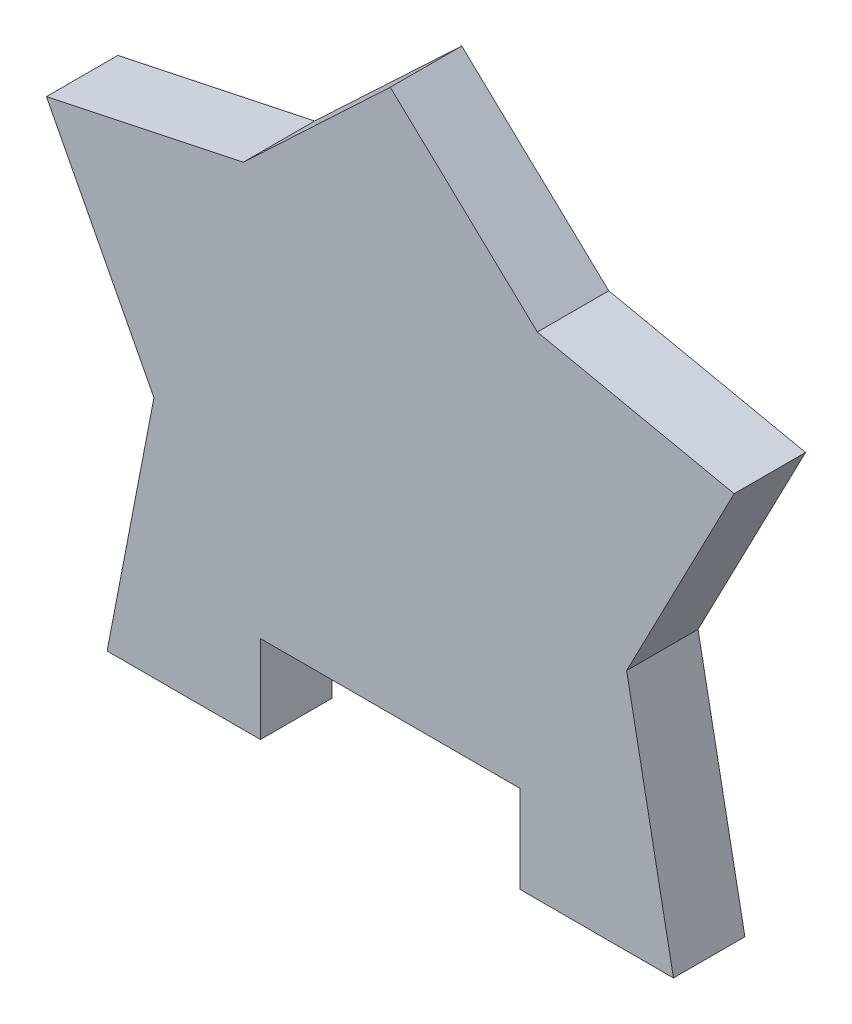
ISO-10303-21;
HEADER;
FILE_DESCRIPTION(('STEP AP214'),'2;1');
FILE_NAME('part.step','',(''),(''),'','','');
FILE_SCHEMA(('AUTOMOTIVE_DESIGN { 1 0 10303 214 1 1 1 1 }'));
ENDSEC;
DATA;
#1=APPLICATION_CONTEXT('core data for automotive mechanical design processes');
#2=APPLICATION_PROTOCOL_DEFINITION('international standard','automotive_design',2000,#1);
#3=PRODUCT_CONTEXT('',#1,'mechanical');
#4=PRODUCT('Part','Part','',(#3));
#5=PRODUCT_RELATED_PRODUCT_CATEGORY('part','',(#4));
#6=PRODUCT_DEFINITION_FORMATION('','',#4);
#7=PRODUCT_DEFINITION_CONTEXT('part definition',#1,'design');
#8=PRODUCT_DEFINITION('design','',#6,#7);
#9=PRODUCT_DEFINITION_SHAPE('','',#8);
#10=(LENGTH_UNIT() NAMED_UNIT(*) SI_UNIT(.MILLI.,.METRE.));
#11=(NAMED_UNIT(*) PLANE_ANGLE_UNIT() SI_UNIT($,.RADIAN.));
#12=(NAMED_UNIT(*) SI_UNIT($,.STERADIAN.) SOLID_ANGLE_UNIT());
#13=UNCERTAINTY_MEASURE_WITH_UNIT(LENGTH_MEASURE(1.E-05),#10,'distance_accuracy_value','');
#14=(GEOMETRIC_REPRESENTATION_CONTEXT(3) GLOBAL_UNCERTAINTY_ASSIGNED_CONTEXT((#13)) GLOBAL_UNIT_ASSIGNED_CONTEXT((#10,
#11,#12)) REPRESENTATION_CONTEXT('',''));
#15=CARTESIAN_POINT('',(0.,0.,0.));
#16=DIRECTION('',(0.,0.,1.));
#17=DIRECTION('',(1.,0.,0.));
#18=AXIS2_PLACEMENT_3D('',#15,#16,#17);
#19=CARTESIAN_POINT('',(0.,44.099252013809,10.));
#20=DIRECTION('',(-0.685525594121033,-0.728048528468402,0.));
#21=DIRECTION('',(0.728048528468402,-0.685525594121033,0.));
#22=AXIS2_PLACEMENT_3D('',#19,#20,#21);
#23=PLANE('',#22);
#24=DIRECTION('',(-0.728048528468402,0.685525594121033,0.));
#25=VECTOR('',#24,1.);
#26=CARTESIAN_POINT('',(0.,44.099252013809,0.));
#27=LINE('',#26,#25);
#28=CARTESIAN_POINT('',(20.593389074951,24.7086554690017,0.));
#29=VERTEX_POINT('',#28);
#30=CARTESIAN_POINT('',(0.,44.099252013809,0.));
#31=VERTEX_POINT('',#30);
#32=EDGE_CURVE('E170',#29,#31,#27,.T.);
#33=ORIENTED_EDGE('',*,*,#32,.T.);
#34=DIRECTION('',(0.,0.,-1.));
#35=VECTOR('',#34,1.);
#36=CARTESIAN_POINT('',(0.,44.099252013809,10.));
#37=LINE('',#36,#35);
#38=CARTESIAN_POINT('',(0.,44.099252013809,10.));
#39=VERTEX_POINT('',#38);
#40=EDGE_CURVE('E11',#39,#31,#37,.T.);
#41=ORIENTED_EDGE('',*,*,#40,.F.);
#42=DIRECTION('',(-0.728048528468402,0.685525594121033,0.));
#43=VECTOR('',#42,1.);
#44=CARTESIAN_POINT('',(0.,44.099252013809,10.));
#45=LINE('',#44,#43);
#46=CARTESIAN_POINT('',(20.593389074951,24.7086554690017,10.));
#47=VERTEX_POINT('',#46);
#48=EDGE_CURVE('E207',#47,#39,#45,.T.);
#49=ORIENTED_EDGE('',*,*,#48,.F.);
#50=DIRECTION('',(0.,0.,-1.));
#51=VECTOR('',#50,1.);
#52=CARTESIAN_POINT('',(20.593389074951,24.7086554690017,10.));
#53=LINE('',#52,#51);
#54=EDGE_CURVE('E166',#47,#29,#53,.T.);
#55=ORIENTED_EDGE('',*,*,#54,.T.);
#56=EDGE_LOOP('',(#33,#41,#49,#55));
#57=FACE_BOUND('',#56,.T.);
#58=ADVANCED_FACE('F39',(#57),#23,.F.);
#59=CARTESIAN_POINT('',(0.,44.099252013809,10.));
#60=DIRECTION('',(0.685525594121033,-0.728048528468401,0.));
#61=DIRECTION('',(0.728048528468401,0.685525594121033,0.));
#62=AXIS2_PLACEMENT_3D('',#59,#60,#61);
#63=PLANE('',#62);
#64=DIRECTION('',(-0.728048528468401,-0.685525594121033,0.));
#65=VECTOR('',#64,1.);
#66=CARTESIAN_POINT('',(0.,44.099252013809,0.));
#67=LINE('',#66,#65);
#68=CARTESIAN_POINT('',(-20.593389074951,24.7086554690017,0.));
#69=VERTEX_POINT('',#68);
#70=EDGE_CURVE('E174',#31,#69,#67,.T.);
#71=ORIENTED_EDGE('',*,*,#70,.T.);
#72=DIRECTION('',(0.,0.,-1.));
#73=VECTOR('',#72,1.);
#74=CARTESIAN_POINT('',(-20.593389074951,24.7086554690017,10.));
#75=LINE('',#74,#73);
#76=CARTESIAN_POINT('',(-20.593389074951,24.7086554690017,10.));
#77=VERTEX_POINT('',#76);
#78=EDGE_CURVE('E48',#77,#69,#75,.T.);
#79=ORIENTED_EDGE('',*,*,#78,.F.);
#80=DIRECTION('',(-0.728048528468401,-0.685525594121033,0.));
#81=VECTOR('',#80,1.);
#82=CARTESIAN_POINT('',(0.,44.099252013809,10.));
#83=LINE('',#82,#81);
#84=EDGE_CURVE('E114',#39,#77,#83,.T.);
#85=ORIENTED_EDGE('',*,*,#84,.F.);
#86=ORIENTED_EDGE('',*,*,#40,.T.);
#87=EDGE_LOOP('',(#71,#79,#85,#86));
#88=FACE_BOUND('',#87,.T.);
#89=ADVANCED_FACE('F308',(#88),#63,.F.);
#90=CARTESIAN_POINT('',(-20.593389074951,24.7086554690017,10.));
#91=DIRECTION('',(0.206772924601104,-0.978388960307661,0.));
#92=DIRECTION('',(0.978388960307661,0.206772924601104,0.));
#93=AXIS2_PLACEMENT_3D('',#90,#91,#92);
#94=PLANE('',#93);
#95=DIRECTION('',(-0.978388960307661,-0.206772924601104,0.));
#96=VECTOR('',#95,1.);
#97=CARTESIAN_POINT('',(-20.593389074951,24.7086554690017,0.));
#98=LINE('',#97,#96);
#99=CARTESIAN_POINT('',(-48.1527328956645,18.8842580635932,0.));
#100=VERTEX_POINT('',#99);
#101=EDGE_CURVE('E177',#69,#100,#98,.T.);
#102=ORIENTED_EDGE('',*,*,#101,.T.);
#103=DIRECTION('',(0.,0.,-1.));
#104=VECTOR('',#103,1.);
#105=CARTESIAN_POINT('',(-48.1527328956645,18.8842580635932,10.));
#106=LINE('',#105,#104);
#107=CARTESIAN_POINT('',(-48.1527328956645,18.8842580635932,10.));
#108=VERTEX_POINT('',#107);
#109=EDGE_CURVE('E238',#108,#100,#106,.T.);
#110=ORIENTED_EDGE('',*,*,#109,.F.);
#111=DIRECTION('',(-0.978388960307661,-0.206772924601104,0.));
#112=VECTOR('',#111,1.);
#113=CARTESIAN_POINT('',(-20.593389074951,24.7086554690017,10.));
#114=LINE('',#113,#112);
#115=EDGE_CURVE('E248',#77,#108,#114,.T.);
#116=ORIENTED_EDGE('',*,*,#115,.F.);
#117=ORIENTED_EDGE('',*,*,#78,.T.);
#118=EDGE_LOOP('',(#102,#110,#116,#117));
#119=FACE_BOUND('',#118,.T.);
#120=ADVANCED_FACE('F246',(#119),#94,.F.);
#121=CARTESIAN_POINT('',(-48.1527328956645,18.8842580635932,10.));
#122=DIRECTION('',(0.887359195725555,0.461078797778965,0.));
#123=DIRECTION('',(-0.461078797778965,0.887359195725555,0.));
#124=AXIS2_PLACEMENT_3D('',#121,#122,#123);
#125=PLANE('',#124);
#126=DIRECTION('',(0.461078797778965,-0.887359195725555,0.));
#127=VECTOR('',#126,1.);
#128=CARTESIAN_POINT('',(-48.1527328956645,18.8842580635932,0.));
#129=LINE('',#128,#127);
#130=CARTESIAN_POINT('',(-33.0945347255839,-10.0956704901467,0.));
#131=VERTEX_POINT('',#130);
#132=EDGE_CURVE('E180',#100,#131,#129,.T.);
#133=ORIENTED_EDGE('',*,*,#132,.T.);
#134=DIRECTION('',(0.,0.,-1.));
#135=VECTOR('',#134,1.);
#136=CARTESIAN_POINT('',(-33.0945347255839,-10.0956704901467,10.));
#137=LINE('',#136,#135);
#138=CARTESIAN_POINT('',(-33.0945347255839,-10.0956704901467,10.));
#139=VERTEX_POINT('',#138);
#140=EDGE_CURVE('E234',#139,#131,#137,.T.);
#141=ORIENTED_EDGE('',*,*,#140,.F.);
#142=DIRECTION('',(0.461078797778965,-0.887359195725555,0.));
#143=VECTOR('',#142,1.);
#144=CARTESIAN_POINT('',(-48.1527328956645,18.8842580635932,10.));
#145=LINE('',#144,#143);
#146=EDGE_CURVE('E267',#108,#139,#145,.T.);
#147=ORIENTED_EDGE('',*,*,#146,.F.);
#148=ORIENTED_EDGE('',*,*,#109,.T.);
#149=EDGE_LOOP('',(#133,#141,#147,#148));
#150=FACE_BOUND('',#149,.T.);
#151=ADVANCED_FACE('F257',(#150),#125,.F.);
#152=CARTESIAN_POINT('',(-33.0945347255839,-10.0956704901467,10.));
#153=DIRECTION('',(0.981892588561376,-0.189438498009882,0.));
#154=DIRECTION('',(0.189438498009882,0.981892588561376,0.));
#155=AXIS2_PLACEMENT_3D('',#152,#153,#154);
#156=PLANE('',#155);
#157=DIRECTION('',(-0.189438498009882,-0.981892588561376,0.));
#158=VECTOR('',#157,1.);
#159=CARTESIAN_POINT('',(-33.0945347255839,-10.0956704901467,0.));
#160=LINE('',#159,#158);
#161=CARTESIAN_POINT('',(-39.6549136161478,-44.099252013809,0.));
#162=VERTEX_POINT('',#161);
#163=EDGE_CURVE('E183',#131,#162,#160,.T.);
#164=ORIENTED_EDGE('',*,*,#163,.T.);
#165=DIRECTION('',(0.,0.,-1.));
#166=VECTOR('',#165,1.);
#167=CARTESIAN_POINT('',(-39.6549136161478,-44.099252013809,10.));
#168=LINE('',#167,#166);
#169=CARTESIAN_POINT('',(-39.6549136161478,-44.099252013809,10.));
#170=VERTEX_POINT('',#169);
#171=EDGE_CURVE('E230',#170,#162,#168,.T.);
#172=ORIENTED_EDGE('',*,*,#171,.F.);
#173=DIRECTION('',(-0.189438498009882,-0.981892588561376,0.));
#174=VECTOR('',#173,1.);
#175=CARTESIAN_POINT('',(-33.0945347255839,-10.0956704901467,10.));
#176=LINE('',#175,#174);
#177=EDGE_CURVE('E263',#139,#170,#176,.T.);
#178=ORIENTED_EDGE('',*,*,#177,.F.);
#179=ORIENTED_EDGE('',*,*,#140,.T.);
#180=EDGE_LOOP('',(#164,#172,#178,#179));
#181=FACE_BOUND('',#180,.T.);
#182=ADVANCED_FACE('F261',(#181),#156,.F.);
#183=CARTESIAN_POINT('',(-39.6549136161478,-44.099252013809,10.));
#184=DIRECTION('',(0.,1.,0.));
#185=DIRECTION('',(0.,0.,1.));
#186=AXIS2_PLACEMENT_3D('',#183,#184,#185);
#187=PLANE('',#186);
#188=DIRECTION('',(1.,0.,0.));
#189=VECTOR('',#188,1.);
#190=CARTESIAN_POINT('',(-39.6549136161478,-44.099252013809,0.));
#191=LINE('',#190,#189);
#192=CARTESIAN_POINT('',(-18.178395028806,-44.099252013809,0.));
#193=VERTEX_POINT('',#192);
#194=EDGE_CURVE('E186',#162,#193,#191,.T.);
#195=ORIENTED_EDGE('',*,*,#194,.T.);
#196=DIRECTION('',(0.,0.,-1.));
#197=VECTOR('',#196,1.);
#198=CARTESIAN_POINT('',(-18.178395028806,-44.099252013809,10.));
#199=LINE('',#198,#197);
#200=CARTESIAN_POINT('',(-18.178395028806,-44.099252013809,10.));
#201=VERTEX_POINT('',#200);
#202=EDGE_CURVE('E226',#201,#193,#199,.T.);
#203=ORIENTED_EDGE('',*,*,#202,.F.);
#204=DIRECTION('',(1.,0.,0.));
#205=VECTOR('',#204,1.);
#206=CARTESIAN_POINT('',(-39.6549136161478,-44.099252013809,10.));
#207=LINE('',#206,#205);
#208=EDGE_CURVE('E266',#170,#201,#207,.T.);
#209=ORIENTED_EDGE('',*,*,#208,.F.);
#210=ORIENTED_EDGE('',*,*,#171,.T.);
#211=EDGE_LOOP('',(#195,#203,#209,#210));
#212=FACE_BOUND('',#211,.T.);
#213=ADVANCED_FACE('F321',(#212),#187,.F.);
#214=CARTESIAN_POINT('',(-18.178395028806,-44.099252013809,10.));
#215=DIRECTION('',(-1.,0.,0.));
#216=DIRECTION('',(0.,0.,1.));
#217=AXIS2_PLACEMENT_3D('',#214,#215,#216);
#218=PLANE('',#217);
#219=DIRECTION('',(0.,1.,0.));
#220=VECTOR('',#219,1.);
#221=CARTESIAN_POINT('',(-18.178395028806,-44.099252013809,0.));
#222=LINE('',#221,#220);
#223=CARTESIAN_POINT('',(-18.178395028806,-31.8479770884278,0.));
#224=VERTEX_POINT('',#223);
#225=EDGE_CURVE('E189',#193,#224,#222,.T.);
#226=ORIENTED_EDGE('',*,*,#225,.T.);
#227=DIRECTION('',(0.,0.,-1.));
#228=VECTOR('',#227,1.);
#229=CARTESIAN_POINT('',(-18.178395028806,-31.8479770884278,10.));
#230=LINE('',#229,#228);
#231=CARTESIAN_POINT('',(-18.178395028806,-31.8479770884278,10.));
#232=VERTEX_POINT('',#231);
#233=EDGE_CURVE('E222',#232,#224,#230,.T.);
#234=ORIENTED_EDGE('',*,*,#233,.F.);
#235=DIRECTION('',(0.,1.,0.));
#236=VECTOR('',#235,1.);
#237=CARTESIAN_POINT('',(-18.178395028806,-44.099252013809,10.));
#238=LINE('',#237,#236);
#239=EDGE_CURVE('E271',#201,#232,#238,.T.);
#240=ORIENTED_EDGE('',*,*,#239,.F.);
#241=ORIENTED_EDGE('',*,*,#202,.T.);
#242=EDGE_LOOP('',(#226,#234,#240,#241));
#243=FACE_BOUND('',#242,.T.);
#244=ADVANCED_FACE('F324',(#243),#218,.F.);
#245=CARTESIAN_POINT('',(-18.178395028806,-31.8479770884278,10.));
#246=DIRECTION('',(0.,1.,0.));
#247=DIRECTION('',(-1.,0.,0.));
#248=AXIS2_PLACEMENT_3D('',#245,#246,#247);
#249=PLANE('',#248);
#250=DIRECTION('',(1.,0.,0.));
#251=VECTOR('',#250,1.);
#252=CARTESIAN_POINT('',(-18.178395028806,-31.8479770884278,0.));
#253=LINE('',#252,#251);
#254=CARTESIAN_POINT('',(18.178395028806,-31.8479770884278,0.));
#255=VERTEX_POINT('',#254);
#256=EDGE_CURVE('E192',#224,#255,#253,.T.);
#257=ORIENTED_EDGE('',*,*,#256,.T.);
#258=DIRECTION('',(0.,0.,-1.));
#259=VECTOR('',#258,1.);
#260=CARTESIAN_POINT('',(18.178395028806,-31.8479770884278,10.));
#261=LINE('',#260,#259);
#262=CARTESIAN_POINT('',(18.178395028806,-31.8479770884278,10.));
#263=VERTEX_POINT('',#262);
#264=EDGE_CURVE('E218',#263,#255,#261,.T.);
#265=ORIENTED_EDGE('',*,*,#264,.F.);
#266=DIRECTION('',(1.,0.,0.));
#267=VECTOR('',#266,1.);
#268=CARTESIAN_POINT('',(-18.178395028806,-31.8479770884278,10.));
#269=LINE('',#268,#267);
#270=EDGE_CURVE('E278',#232,#263,#269,.T.);
#271=ORIENTED_EDGE('',*,*,#270,.F.);
#272=ORIENTED_EDGE('',*,*,#233,.T.);
#273=EDGE_LOOP('',(#257,#265,#271,#272));
#274=FACE_BOUND('',#273,.T.);
#275=ADVANCED_FACE('F328',(#274),#249,.F.);
#276=CARTESIAN_POINT('',(18.178395028806,-44.099252013809,10.));
#277=DIRECTION('',(1.,0.,0.));
#278=DIRECTION('',(0.,1.,0.));
#279=AXIS2_PLACEMENT_3D('',#276,#277,#278);
#280=PLANE('',#279);
#281=DIRECTION('',(0.,-1.,0.));
#282=VECTOR('',#281,1.);
#283=CARTESIAN_POINT('',(18.178395028806,-44.099252013809,0.));
#284=LINE('',#283,#282);
#285=CARTESIAN_POINT('',(18.178395028806,-44.099252013809,0.));
#286=VERTEX_POINT('',#285);
#287=EDGE_CURVE('E195',#255,#286,#284,.T.);
#288=ORIENTED_EDGE('',*,*,#287,.T.);
#289=DIRECTION('',(0.,0.,-1.));
#290=VECTOR('',#289,1.);
#291=CARTESIAN_POINT('',(18.178395028806,-44.099252013809,10.));
#292=LINE('',#291,#290);
#293=CARTESIAN_POINT('',(18.178395028806,-44.099252013809,10.));
#294=VERTEX_POINT('',#293);
#295=EDGE_CURVE('E214',#294,#286,#292,.T.);
#296=ORIENTED_EDGE('',*,*,#295,.F.);
#297=DIRECTION('',(0.,-1.,0.));
#298=VECTOR('',#297,1.);
#299=CARTESIAN_POINT('',(18.178395028806,-44.099252013809,10.));
#300=LINE('',#299,#298);
#301=EDGE_CURVE('E281',#263,#294,#300,.T.);
#302=ORIENTED_EDGE('',*,*,#301,.F.);
#303=ORIENTED_EDGE('',*,*,#264,.T.);
#304=EDGE_LOOP('',(#288,#296,#302,#303));
#305=FACE_BOUND('',#304,.T.);
#306=ADVANCED_FACE('F289',(#305),#280,.F.);
#307=CARTESIAN_POINT('',(39.6549136161478,-44.099252013809,10.));
#308=DIRECTION('',(0.,1.,0.));
#309=DIRECTION('',(-1.,0.,0.));
#310=AXIS2_PLACEMENT_3D('',#307,#308,#309);
#311=PLANE('',#310);
#312=DIRECTION('',(1.,0.,0.));
#313=VECTOR('',#312,1.);
#314=CARTESIAN_POINT('',(39.6549136161478,-44.099252013809,0.));
#315=LINE('',#314,#313);
#316=CARTESIAN_POINT('',(39.6549136161478,-44.099252013809,0.));
#317=VERTEX_POINT('',#316);
#318=EDGE_CURVE('E198',#286,#317,#315,.T.);
#319=ORIENTED_EDGE('',*,*,#318,.T.);
#320=DIRECTION('',(0.,0.,-1.));
#321=VECTOR('',#320,1.);
#322=CARTESIAN_POINT('',(39.6549136161478,-44.099252013809,10.));
#323=LINE('',#322,#321);
#324=CARTESIAN_POINT('',(39.6549136161478,-44.099252013809,10.));
#325=VERTEX_POINT('',#324);
#326=EDGE_CURVE('E159',#325,#317,#323,.T.);
#327=ORIENTED_EDGE('',*,*,#326,.F.);
#328=DIRECTION('',(1.,0.,0.));
#329=VECTOR('',#328,1.);
#330=CARTESIAN_POINT('',(39.6549136161478,-44.099252013809,10.));
#331=LINE('',#330,#329);
#332=EDGE_CURVE('E148',#294,#325,#331,.T.);
#333=ORIENTED_EDGE('',*,*,#332,.F.);
#334=ORIENTED_EDGE('',*,*,#295,.T.);
#335=EDGE_LOOP('',(#319,#327,#333,#334));
#336=FACE_BOUND('',#335,.T.);
#337=ADVANCED_FACE('F293',(#336),#311,.F.);
#338=CARTESIAN_POINT('',(33.0945347255839,-10.0956704901467,10.));
#339=DIRECTION('',(-0.981892588561376,-0.189438498009882,0.));
#340=DIRECTION('',(0.189438498009882,-0.981892588561376,0.));
#341=AXIS2_PLACEMENT_3D('',#338,#339,#340);
#342=PLANE('',#341);
#343=DIRECTION('',(-0.189438498009882,0.981892588561376,0.));
#344=VECTOR('',#343,1.);
#345=CARTESIAN_POINT('',(33.0945347255839,-10.0956704901467,0.));
#346=LINE('',#345,#344);
#347=CARTESIAN_POINT('',(33.0945347255839,-10.0956704901467,0.));
#348=VERTEX_POINT('',#347);
#349=EDGE_CURVE('E157',#317,#348,#346,.T.);
#350=ORIENTED_EDGE('',*,*,#349,.T.);
#351=DIRECTION('',(0.,0.,-1.));
#352=VECTOR('',#351,1.);
#353=CARTESIAN_POINT('',(33.0945347255839,-10.0956704901467,10.));
#354=LINE('',#353,#352);
#355=CARTESIAN_POINT('',(33.0945347255839,-10.0956704901467,10.));
#356=VERTEX_POINT('',#355);
#357=EDGE_CURVE('E154',#356,#348,#354,.T.);
#358=ORIENTED_EDGE('',*,*,#357,.F.);
#359=DIRECTION('',(-0.189438498009882,0.981892588561376,0.));
#360=VECTOR('',#359,1.);
#361=CARTESIAN_POINT('',(33.0945347255839,-10.0956704901467,10.));
#362=LINE('',#361,#360);
#363=EDGE_CURVE('E142',#325,#356,#362,.T.);
#364=ORIENTED_EDGE('',*,*,#363,.F.);
#365=ORIENTED_EDGE('',*,*,#326,.T.);
#366=EDGE_LOOP('',(#350,#358,#364,#365));
#367=FACE_BOUND('',#366,.T.);
#368=ADVANCED_FACE('F155',(#367),#342,.F.);
#369=CARTESIAN_POINT('',(48.1527328956645,18.8842580635932,10.));
#370=DIRECTION('',(-0.887359195725555,0.461078797778965,0.));
#371=DIRECTION('',(-0.461078797778965,-0.887359195725555,0.));
#372=AXIS2_PLACEMENT_3D('',#369,#370,#371);
#373=PLANE('',#372);
#374=DIRECTION('',(0.461078797778965,0.887359195725555,0.));
#375=VECTOR('',#374,1.);
#376=CARTESIAN_POINT('',(48.1527328956645,18.8842580635932,0.));
#377=LINE('',#376,#375);
#378=CARTESIAN_POINT('',(48.1527328956645,18.8842580635932,0.));
#379=VERTEX_POINT('',#378);
#380=EDGE_CURVE('E100',#348,#379,#377,.T.);
#381=ORIENTED_EDGE('',*,*,#380,.T.);
#382=DIRECTION('',(0.,0.,-1.));
#383=VECTOR('',#382,1.);
#384=CARTESIAN_POINT('',(48.1527328956645,18.8842580635932,10.));
#385=LINE('',#384,#383);
#386=CARTESIAN_POINT('',(48.1527328956645,18.8842580635932,10.));
#387=VERTEX_POINT('',#386);
#388=EDGE_CURVE('E160',#387,#379,#385,.T.);
#389=ORIENTED_EDGE('',*,*,#388,.F.);
#390=DIRECTION('',(0.461078797778965,0.887359195725555,0.));
#391=VECTOR('',#390,1.);
#392=CARTESIAN_POINT('',(48.1527328956645,18.8842580635932,10.));
#393=LINE('',#392,#391);
#394=EDGE_CURVE('E146',#356,#387,#393,.T.);
#395=ORIENTED_EDGE('',*,*,#394,.F.);
#396=ORIENTED_EDGE('',*,*,#357,.T.);
#397=EDGE_LOOP('',(#381,#389,#395,#396));
#398=FACE_BOUND('',#397,.T.);
#399=ADVANCED_FACE('F162',(#398),#373,.F.);
#400=CARTESIAN_POINT('',(20.593389074951,24.7086554690017,10.));
#401=DIRECTION('',(-0.206772924601104,-0.978388960307661,0.));
#402=DIRECTION('',(0.978388960307661,-0.206772924601104,0.));
#403=AXIS2_PLACEMENT_3D('',#400,#401,#402);
#404=PLANE('',#403);
#405=DIRECTION('',(-0.978388960307661,0.206772924601104,0.));
#406=VECTOR('',#405,1.);
#407=CARTESIAN_POINT('',(20.593389074951,24.7086554690017,0.));
#408=LINE('',#407,#406);
#409=EDGE_CURVE('E106',#379,#29,#408,.T.);
#410=ORIENTED_EDGE('',*,*,#409,.T.);
#411=ORIENTED_EDGE('',*,*,#54,.F.);
#412=DIRECTION('',(-0.978388960307661,0.206772924601104,0.));
#413=VECTOR('',#412,1.);
#414=CARTESIAN_POINT('',(20.593389074951,24.7086554690017,10.));
#415=LINE('',#414,#413);
#416=EDGE_CURVE('E56',#387,#47,#415,.T.);
#417=ORIENTED_EDGE('',*,*,#416,.F.);
#418=ORIENTED_EDGE('',*,*,#388,.T.);
#419=EDGE_LOOP('',(#410,#411,#417,#418));
#420=FACE_BOUND('',#419,.T.);
#421=ADVANCED_FACE('F297',(#420),#404,.F.);
#422=CARTESIAN_POINT('',(0.,0.,10.));
#423=DIRECTION('',(0.,0.,-1.));
#424=DIRECTION('',(-1.,0.,0.));
#425=AXIS2_PLACEMENT_3D('',#422,#423,#424);
#426=PLANE('',#425);
#427=ORIENTED_EDGE('',*,*,#48,.T.);
#428=ORIENTED_EDGE('',*,*,#84,.T.);
#429=ORIENTED_EDGE('',*,*,#115,.T.);
#430=ORIENTED_EDGE('',*,*,#146,.T.);
#431=ORIENTED_EDGE('',*,*,#177,.T.);
#432=ORIENTED_EDGE('',*,*,#208,.T.);
#433=ORIENTED_EDGE('',*,*,#239,.T.);
#434=ORIENTED_EDGE('',*,*,#270,.T.);
#435=ORIENTED_EDGE('',*,*,#301,.T.);
#436=ORIENTED_EDGE('',*,*,#332,.T.);
#437=ORIENTED_EDGE('',*,*,#363,.T.);
#438=ORIENTED_EDGE('',*,*,#394,.T.);
#439=ORIENTED_EDGE('',*,*,#416,.T.);
#440=EDGE_LOOP('',(#427,#428,#429,#430,#431,#432,#433,#434,#435,#436,#437,#438,#439));
#441=FACE_BOUND('',#440,.T.);
#442=ADVANCED_FACE('F144',(#441),#426,.F.);
#443=CARTESIAN_POINT('',(0.,0.,0.));
#444=DIRECTION('',(0.,0.,-1.));
#445=DIRECTION('',(-1.,0.,0.));
#446=AXIS2_PLACEMENT_3D('',#443,#444,#445);
#447=PLANE('',#446);
#448=ORIENTED_EDGE('',*,*,#32,.F.);
#449=ORIENTED_EDGE('',*,*,#409,.F.);
#450=ORIENTED_EDGE('',*,*,#380,.F.);
#451=ORIENTED_EDGE('',*,*,#349,.F.);
#452=ORIENTED_EDGE('',*,*,#318,.F.);
#453=ORIENTED_EDGE('',*,*,#287,.F.);
#454=ORIENTED_EDGE('',*,*,#256,.F.);
#455=ORIENTED_EDGE('',*,*,#225,.F.);
#456=ORIENTED_EDGE('',*,*,#194,.F.);
#457=ORIENTED_EDGE('',*,*,#163,.F.);
#458=ORIENTED_EDGE('',*,*,#132,.F.);
#459=ORIENTED_EDGE('',*,*,#101,.F.);
#460=ORIENTED_EDGE('',*,*,#70,.F.);
#461=EDGE_LOOP('',(#448,#449,#450,#451,#452,#453,#454,#455,#456,#457,#458,#459,#460));
#462=FACE_BOUND('',#461,.T.);
#463=ADVANCED_FACE('F252',(#462),#447,.T.);
#464=CLOSED_SHELL('',(#58,#89,#120,#151,#182,#213,#244,#275,#306,#337,#368,#399,#421,#442,#463));
#465=MANIFOLD_SOLID_BREP('B2',#464);
#466=ADVANCED_BREP_SHAPE_REPRESENTATION('',(#18,#465),#14);
#467=SHAPE_DEFINITION_REPRESENTATION(#9,#466);
ENDSEC;
END-ISO-10303-21;
